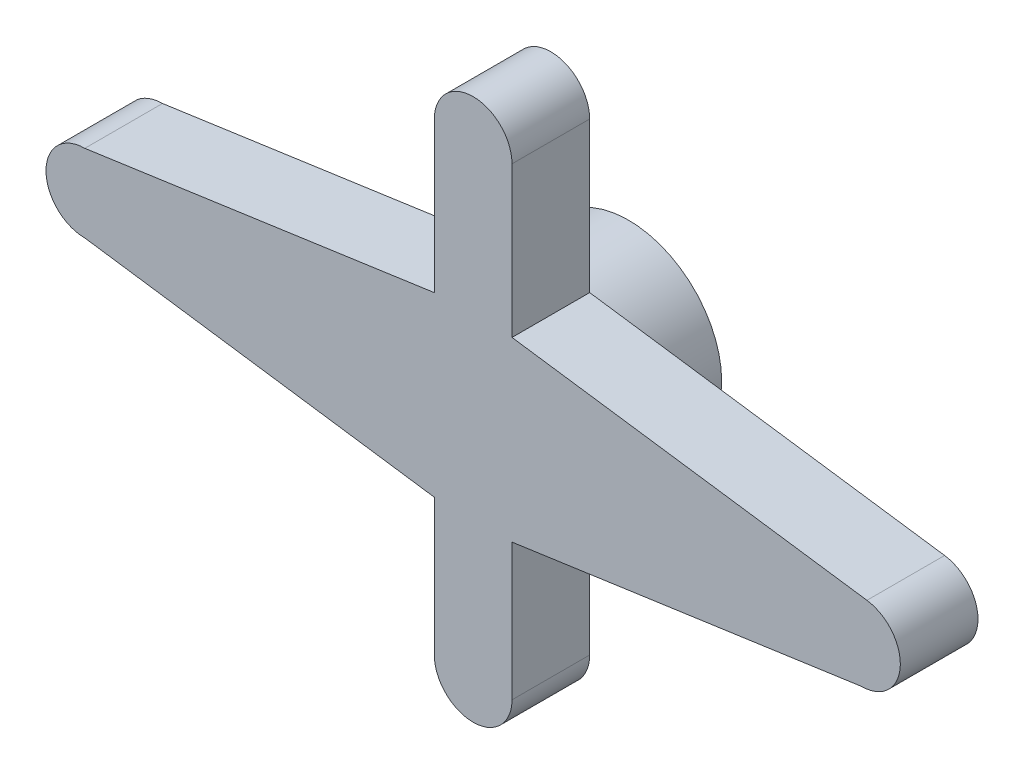
ISO-10303-21;
HEADER;
FILE_DESCRIPTION(('STEP AP214'),'2;1');
FILE_NAME('part.step','',(''),(''),'','','');
FILE_SCHEMA(('AUTOMOTIVE_DESIGN { 1 0 10303 214 1 1 1 1 }'));
ENDSEC;
DATA;
#1=APPLICATION_CONTEXT('core data for automotive mechanical design processes');
#2=APPLICATION_PROTOCOL_DEFINITION('international standard','automotive_design',2000,#1);
#3=PRODUCT_CONTEXT('',#1,'mechanical');
#4=PRODUCT('Part','Part','',(#3));
#5=PRODUCT_RELATED_PRODUCT_CATEGORY('part','',(#4));
#6=PRODUCT_DEFINITION_FORMATION('','',#4);
#7=PRODUCT_DEFINITION_CONTEXT('part definition',#1,'design');
#8=PRODUCT_DEFINITION('design','',#6,#7);
#9=PRODUCT_DEFINITION_SHAPE('','',#8);
#10=(LENGTH_UNIT() NAMED_UNIT(*) SI_UNIT(.MILLI.,.METRE.));
#11=(NAMED_UNIT(*) PLANE_ANGLE_UNIT() SI_UNIT($,.RADIAN.));
#12=(NAMED_UNIT(*) SI_UNIT($,.STERADIAN.) SOLID_ANGLE_UNIT());
#13=UNCERTAINTY_MEASURE_WITH_UNIT(LENGTH_MEASURE(1.E-05),#10,'distance_accuracy_value','');
#14=(GEOMETRIC_REPRESENTATION_CONTEXT(3) GLOBAL_UNCERTAINTY_ASSIGNED_CONTEXT((#13)) GLOBAL_UNIT_ASSIGNED_CONTEXT((#10,
#11,#12)) REPRESENTATION_CONTEXT('',''));
#15=CARTESIAN_POINT('',(0.,0.,0.));
#16=DIRECTION('',(0.,0.,1.));
#17=DIRECTION('',(1.,0.,0.));
#18=AXIS2_PLACEMENT_3D('',#15,#16,#17);
#19=CARTESIAN_POINT('',(0.,0.,0.));
#20=DIRECTION('',(0.,0.,1.));
#21=DIRECTION('',(1.,0.,0.));
#22=AXIS2_PLACEMENT_3D('',#19,#20,#21);
#23=PLANE('',#22);
#24=CARTESIAN_POINT('',(0.,0.,0.));
#25=DIRECTION('',(0.,0.,1.));
#26=DIRECTION('',(1.,0.,0.));
#27=AXIS2_PLACEMENT_3D('',#24,#25,#26);
#28=CIRCLE('',#27,5.);
#29=CARTESIAN_POINT('',(5.,0.,0.));
#30=VERTEX_POINT('',#29);
#31=EDGE_CURVE('E221',#30,#30,#28,.T.);
#32=ORIENTED_EDGE('',*,*,#31,.T.);
#33=EDGE_LOOP('',(#32));
#34=FACE_BOUND('',#33,.T.);
#35=CARTESIAN_POINT('',(0.,0.,0.));
#36=DIRECTION('',(0.,0.,1.));
#37=DIRECTION('',(1.,0.,0.));
#38=AXIS2_PLACEMENT_3D('',#35,#36,#37);
#39=CIRCLE('',#38,6.);
#40=CARTESIAN_POINT('',(6.,0.,0.));
#41=VERTEX_POINT('',#40);
#42=EDGE_CURVE('E49',#41,#41,#39,.T.);
#43=ORIENTED_EDGE('',*,*,#42,.F.);
#44=EDGE_LOOP('',(#43));
#45=FACE_BOUND('',#44,.T.);
#46=ADVANCED_FACE('F45',(#34,#45),#23,.F.);
#47=CARTESIAN_POINT('',(0.,0.,0.));
#48=DIRECTION('',(0.,0.,1.));
#49=DIRECTION('',(1.,0.,0.));
#50=AXIS2_PLACEMENT_3D('',#47,#48,#49);
#51=CYLINDRICAL_SURFACE('',#50,6.);
#52=CARTESIAN_POINT('',(0.,0.,5.));
#53=DIRECTION('',(0.,0.,1.));
#54=DIRECTION('',(1.,0.,0.));
#55=AXIS2_PLACEMENT_3D('',#52,#53,#54);
#56=CIRCLE('',#55,6.);
#57=CARTESIAN_POINT('',(6.,0.,5.));
#58=VERTEX_POINT('',#57);
#59=EDGE_CURVE('E12',#58,#58,#56,.T.);
#60=ORIENTED_EDGE('',*,*,#59,.F.);
#61=EDGE_LOOP('',(#60));
#62=FACE_BOUND('',#61,.T.);
#63=ORIENTED_EDGE('',*,*,#42,.T.);
#64=EDGE_LOOP('',(#63));
#65=FACE_BOUND('',#64,.T.);
#66=ADVANCED_FACE('F47',(#62,#65),#51,.T.);
#67=CARTESIAN_POINT('',(0.,0.,0.));
#68=DIRECTION('',(0.,0.,1.));
#69=DIRECTION('',(1.,0.,0.));
#70=AXIS2_PLACEMENT_3D('',#67,#68,#69);
#71=CYLINDRICAL_SURFACE('',#70,5.);
#72=CARTESIAN_POINT('',(0.,0.,5.));
#73=DIRECTION('',(0.,0.,1.));
#74=DIRECTION('',(1.,0.,0.));
#75=AXIS2_PLACEMENT_3D('',#72,#73,#74);
#76=CIRCLE('',#75,5.);
#77=CARTESIAN_POINT('',(5.,0.,5.));
#78=VERTEX_POINT('',#77);
#79=EDGE_CURVE('E220',#78,#78,#76,.T.);
#80=ORIENTED_EDGE('',*,*,#79,.T.);
#81=EDGE_LOOP('',(#80));
#82=FACE_BOUND('',#81,.T.);
#83=ORIENTED_EDGE('',*,*,#31,.F.);
#84=EDGE_LOOP('',(#83));
#85=FACE_BOUND('',#84,.T.);
#86=ADVANCED_FACE('F227',(#82,#85),#71,.F.);
#87=CARTESIAN_POINT('',(-25.,0.,5.));
#88=DIRECTION('',(0.,0.,1.));
#89=DIRECTION('',(1.,0.,0.));
#90=AXIS2_PLACEMENT_3D('',#87,#88,#89);
#91=PLANE('',#90);
#92=ORIENTED_EDGE('',*,*,#59,.T.);
#93=EDGE_LOOP('',(#92));
#94=FACE_BOUND('',#93,.T.);
#95=CARTESIAN_POINT('',(-25.,0.,5.));
#96=DIRECTION('',(0.,0.,1.));
#97=DIRECTION('',(1.,0.,0.));
#98=AXIS2_PLACEMENT_3D('',#95,#96,#97);
#99=CIRCLE('',#98,2.5);
#100=CARTESIAN_POINT('',(-25.,2.5,5.));
#101=VERTEX_POINT('',#100);
#102=CARTESIAN_POINT('',(-25.,-2.5,5.));
#103=VERTEX_POINT('',#102);
#104=EDGE_CURVE('E168',#101,#103,#99,.T.);
#105=ORIENTED_EDGE('',*,*,#104,.F.);
#106=DIRECTION('',(0.990013224396831,0.140974520816319,0.));
#107=VECTOR('',#106,1.);
#108=CARTESIAN_POINT('',(-25.,2.5,5.));
#109=LINE('',#108,#107);
#110=CARTESIAN_POINT('',(-2.5,5.70392358425282,5.));
#111=VERTEX_POINT('',#110);
#112=EDGE_CURVE('E195',#101,#111,#109,.T.);
#113=ORIENTED_EDGE('',*,*,#112,.T.);
#114=DIRECTION('',(0.,-1.,0.));
#115=VECTOR('',#114,1.);
#116=CARTESIAN_POINT('',(-2.5,15.384581874595,5.));
#117=LINE('',#116,#115);
#118=CARTESIAN_POINT('',(-2.5,15.384581874595,5.));
#119=VERTEX_POINT('',#118);
#120=EDGE_CURVE('E193',#119,#111,#117,.T.);
#121=ORIENTED_EDGE('',*,*,#120,.F.);
#122=CARTESIAN_POINT('',(0.,15.384581874595,5.));
#123=DIRECTION('',(0.,0.,1.));
#124=DIRECTION('',(1.,0.,0.));
#125=AXIS2_PLACEMENT_3D('',#122,#123,#124);
#126=CIRCLE('',#125,2.5);
#127=CARTESIAN_POINT('',(2.5,15.384581874595,5.));
#128=VERTEX_POINT('',#127);
#129=EDGE_CURVE('E157',#128,#119,#126,.T.);
#130=ORIENTED_EDGE('',*,*,#129,.F.);
#131=DIRECTION('',(0.,-1.,0.));
#132=VECTOR('',#131,1.);
#133=CARTESIAN_POINT('',(2.5,15.384581874595,5.));
#134=LINE('',#133,#132);
#135=CARTESIAN_POINT('',(2.5,5.70562885237556,5.));
#136=VERTEX_POINT('',#135);
#137=EDGE_CURVE('E189',#128,#136,#134,.T.);
#138=ORIENTED_EDGE('',*,*,#137,.T.);
#139=DIRECTION('',(0.990154918840871,-0.139975843256002,0.));
#140=VECTOR('',#139,1.);
#141=CARTESIAN_POINT('',(2.5,5.70562885237556,5.));
#142=LINE('',#141,#140);
#143=CARTESIAN_POINT('',(25.34993960814,2.47538729710218,5.));
#144=VERTEX_POINT('',#143);
#145=EDGE_CURVE('E186',#136,#144,#142,.T.);
#146=ORIENTED_EDGE('',*,*,#145,.T.);
#147=CARTESIAN_POINT('',(25.,0.,5.));
#148=DIRECTION('',(0.,0.,1.));
#149=DIRECTION('',(1.,0.,0.));
#150=AXIS2_PLACEMENT_3D('',#147,#148,#149);
#151=CIRCLE('',#150,2.5);
#152=CARTESIAN_POINT('',(25.,-2.5,5.));
#153=VERTEX_POINT('',#152);
#154=EDGE_CURVE('E183',#153,#144,#151,.T.);
#155=ORIENTED_EDGE('',*,*,#154,.F.);
#156=DIRECTION('',(-0.990013224396831,-0.140974520816319,0.));
#157=VECTOR('',#156,1.);
#158=CARTESIAN_POINT('',(25.,-2.5,5.));
#159=LINE('',#158,#157);
#160=CARTESIAN_POINT('',(2.5,-5.70392358425282,5.));
#161=VERTEX_POINT('',#160);
#162=EDGE_CURVE('E180',#153,#161,#159,.T.);
#163=ORIENTED_EDGE('',*,*,#162,.T.);
#164=DIRECTION('',(0.,-1.,0.));
#165=VECTOR('',#164,1.);
#166=CARTESIAN_POINT('',(2.5,-5.70392358425282,5.));
#167=LINE('',#166,#165);
#168=CARTESIAN_POINT('',(2.5,-14.4986310657942,5.));
#169=VERTEX_POINT('',#168);
#170=EDGE_CURVE('E177',#161,#169,#167,.T.);
#171=ORIENTED_EDGE('',*,*,#170,.T.);
#172=CARTESIAN_POINT('',(0.,-14.4986310657942,5.));
#173=DIRECTION('',(0.,0.,1.));
#174=DIRECTION('',(1.,0.,0.));
#175=AXIS2_PLACEMENT_3D('',#172,#173,#174);
#176=CIRCLE('',#175,2.5);
#177=CARTESIAN_POINT('',(-2.5,-14.4986310657942,5.));
#178=VERTEX_POINT('',#177);
#179=EDGE_CURVE('E174',#178,#169,#176,.T.);
#180=ORIENTED_EDGE('',*,*,#179,.F.);
#181=DIRECTION('',(0.,-1.,0.));
#182=VECTOR('',#181,1.);
#183=CARTESIAN_POINT('',(-2.5,-5.70392358425282,5.));
#184=LINE('',#183,#182);
#185=CARTESIAN_POINT('',(-2.5,-5.70392358425282,5.));
#186=VERTEX_POINT('',#185);
#187=EDGE_CURVE('E172',#186,#178,#184,.T.);
#188=ORIENTED_EDGE('',*,*,#187,.F.);
#189=DIRECTION('',(0.990013224396831,-0.140974520816319,0.));
#190=VECTOR('',#189,1.);
#191=CARTESIAN_POINT('',(-25.,-2.5,5.));
#192=LINE('',#191,#190);
#193=EDGE_CURVE('E170',#103,#186,#192,.T.);
#194=ORIENTED_EDGE('',*,*,#193,.F.);
#195=EDGE_LOOP('',(#105,#113,#121,#130,#138,#146,#155,#163,#171,#180,#188,#194));
#196=FACE_BOUND('',#195,.T.);
#197=ADVANCED_FACE('F234',(#94,#196),#91,.F.);
#198=CARTESIAN_POINT('',(-25.,0.,10.));
#199=DIRECTION('',(0.,0.,1.));
#200=DIRECTION('',(1.,0.,0.));
#201=AXIS2_PLACEMENT_3D('',#198,#199,#200);
#202=PLANE('',#201);
#203=CARTESIAN_POINT('',(-25.,0.,10.));
#204=DIRECTION('',(0.,0.,1.));
#205=DIRECTION('',(1.,0.,0.));
#206=AXIS2_PLACEMENT_3D('',#203,#204,#205);
#207=CIRCLE('',#206,2.5);
#208=CARTESIAN_POINT('',(-25.,2.5,10.));
#209=VERTEX_POINT('',#208);
#210=CARTESIAN_POINT('',(-25.,-2.5,10.));
#211=VERTEX_POINT('',#210);
#212=EDGE_CURVE('E198',#209,#211,#207,.T.);
#213=ORIENTED_EDGE('',*,*,#212,.T.);
#214=DIRECTION('',(0.990013224396831,-0.140974520816319,0.));
#215=VECTOR('',#214,1.);
#216=CARTESIAN_POINT('',(-25.,-2.5,10.));
#217=LINE('',#216,#215);
#218=CARTESIAN_POINT('',(-2.5,-5.70392358425282,10.));
#219=VERTEX_POINT('',#218);
#220=EDGE_CURVE('E114',#211,#219,#217,.T.);
#221=ORIENTED_EDGE('',*,*,#220,.T.);
#222=DIRECTION('',(0.,-1.,0.));
#223=VECTOR('',#222,1.);
#224=CARTESIAN_POINT('',(-2.5,-5.70392358425282,10.));
#225=LINE('',#224,#223);
#226=CARTESIAN_POINT('',(-2.5,-14.4986310657942,10.));
#227=VERTEX_POINT('',#226);
#228=EDGE_CURVE('E303',#219,#227,#225,.T.);
#229=ORIENTED_EDGE('',*,*,#228,.T.);
#230=CARTESIAN_POINT('',(0.,-14.4986310657942,10.));
#231=DIRECTION('',(0.,0.,1.));
#232=DIRECTION('',(1.,0.,0.));
#233=AXIS2_PLACEMENT_3D('',#230,#231,#232);
#234=CIRCLE('',#233,2.5);
#235=CARTESIAN_POINT('',(2.5,-14.4986310657942,10.));
#236=VERTEX_POINT('',#235);
#237=EDGE_CURVE('E309',#227,#236,#234,.T.);
#238=ORIENTED_EDGE('',*,*,#237,.T.);
#239=DIRECTION('',(0.,-1.,0.));
#240=VECTOR('',#239,1.);
#241=CARTESIAN_POINT('',(2.5,-5.70392358425282,10.));
#242=LINE('',#241,#240);
#243=CARTESIAN_POINT('',(2.5,-5.70392358425282,10.));
#244=VERTEX_POINT('',#243);
#245=EDGE_CURVE('E311',#244,#236,#242,.T.);
#246=ORIENTED_EDGE('',*,*,#245,.F.);
#247=DIRECTION('',(-0.990013224396831,-0.140974520816319,0.));
#248=VECTOR('',#247,1.);
#249=CARTESIAN_POINT('',(25.,-2.5,10.));
#250=LINE('',#249,#248);
#251=CARTESIAN_POINT('',(25.,-2.5,10.));
#252=VERTEX_POINT('',#251);
#253=EDGE_CURVE('E313',#252,#244,#250,.T.);
#254=ORIENTED_EDGE('',*,*,#253,.F.);
#255=CARTESIAN_POINT('',(25.,0.,10.));
#256=DIRECTION('',(0.,0.,1.));
#257=DIRECTION('',(1.,0.,0.));
#258=AXIS2_PLACEMENT_3D('',#255,#256,#257);
#259=CIRCLE('',#258,2.5);
#260=CARTESIAN_POINT('',(25.34993960814,2.47538729710218,10.));
#261=VERTEX_POINT('',#260);
#262=EDGE_CURVE('E320',#252,#261,#259,.T.);
#263=ORIENTED_EDGE('',*,*,#262,.T.);
#264=DIRECTION('',(0.990154918840871,-0.139975843256002,0.));
#265=VECTOR('',#264,1.);
#266=CARTESIAN_POINT('',(2.5,5.70562885237556,10.));
#267=LINE('',#266,#265);
#268=CARTESIAN_POINT('',(2.5,5.70562885237556,10.));
#269=VERTEX_POINT('',#268);
#270=EDGE_CURVE('E322',#269,#261,#267,.T.);
#271=ORIENTED_EDGE('',*,*,#270,.F.);
#272=DIRECTION('',(0.,-1.,0.));
#273=VECTOR('',#272,1.);
#274=CARTESIAN_POINT('',(2.5,15.384581874595,10.));
#275=LINE('',#274,#273);
#276=CARTESIAN_POINT('',(2.5,15.384581874595,10.));
#277=VERTEX_POINT('',#276);
#278=EDGE_CURVE('E150',#277,#269,#275,.T.);
#279=ORIENTED_EDGE('',*,*,#278,.F.);
#280=CARTESIAN_POINT('',(0.,15.384581874595,10.));
#281=DIRECTION('',(0.,0.,1.));
#282=DIRECTION('',(1.,0.,0.));
#283=AXIS2_PLACEMENT_3D('',#280,#281,#282);
#284=CIRCLE('',#283,2.5);
#285=CARTESIAN_POINT('',(-2.5,15.384581874595,10.));
#286=VERTEX_POINT('',#285);
#287=EDGE_CURVE('E142',#277,#286,#284,.T.);
#288=ORIENTED_EDGE('',*,*,#287,.T.);
#289=DIRECTION('',(0.,-1.,0.));
#290=VECTOR('',#289,1.);
#291=CARTESIAN_POINT('',(-2.5,15.384581874595,10.));
#292=LINE('',#291,#290);
#293=CARTESIAN_POINT('',(-2.5,5.70392358425282,10.));
#294=VERTEX_POINT('',#293);
#295=EDGE_CURVE('E147',#286,#294,#292,.T.);
#296=ORIENTED_EDGE('',*,*,#295,.T.);
#297=DIRECTION('',(0.990013224396831,0.140974520816319,0.));
#298=VECTOR('',#297,1.);
#299=CARTESIAN_POINT('',(-25.,2.5,10.));
#300=LINE('',#299,#298);
#301=EDGE_CURVE('E163',#209,#294,#300,.T.);
#302=ORIENTED_EDGE('',*,*,#301,.F.);
#303=EDGE_LOOP('',(#213,#221,#229,#238,#246,#254,#263,#271,#279,#288,#296,#302));
#304=FACE_BOUND('',#303,.T.);
#305=ADVANCED_FACE('F144',(#304),#202,.T.);
#306=CARTESIAN_POINT('',(-25.,2.5,10.));
#307=DIRECTION('',(-0.140974520816319,0.990013224396831,0.));
#308=DIRECTION('',(-0.99001322439683,-0.140974520816319,0.));
#309=AXIS2_PLACEMENT_3D('',#306,#307,#308);
#310=PLANE('',#309);
#311=ORIENTED_EDGE('',*,*,#112,.F.);
#312=DIRECTION('',(0.,0.,-1.));
#313=VECTOR('',#312,1.);
#314=CARTESIAN_POINT('',(-25.,2.5,10.));
#315=LINE('',#314,#313);
#316=EDGE_CURVE('E62',#209,#101,#315,.T.);
#317=ORIENTED_EDGE('',*,*,#316,.F.);
#318=ORIENTED_EDGE('',*,*,#301,.T.);
#319=DIRECTION('',(0.,0.,-1.));
#320=VECTOR('',#319,1.);
#321=CARTESIAN_POINT('',(-2.5,5.70392358425282,10.));
#322=LINE('',#321,#320);
#323=EDGE_CURVE('E101',#294,#111,#322,.T.);
#324=ORIENTED_EDGE('',*,*,#323,.T.);
#325=EDGE_LOOP('',(#311,#317,#318,#324));
#326=FACE_BOUND('',#325,.T.);
#327=ADVANCED_FACE('F260',(#326),#310,.T.);
#328=CARTESIAN_POINT('',(-2.5,15.384581874595,10.));
#329=DIRECTION('',(1.,0.,0.));
#330=DIRECTION('',(0.,1.,0.));
#331=AXIS2_PLACEMENT_3D('',#328,#329,#330);
#332=PLANE('',#331);
#333=ORIENTED_EDGE('',*,*,#120,.T.);
#334=ORIENTED_EDGE('',*,*,#323,.F.);
#335=ORIENTED_EDGE('',*,*,#295,.F.);
#336=DIRECTION('',(0.,0.,-1.));
#337=VECTOR('',#336,1.);
#338=CARTESIAN_POINT('',(-2.5,15.384581874595,10.));
#339=LINE('',#338,#337);
#340=EDGE_CURVE('E154',#286,#119,#339,.T.);
#341=ORIENTED_EDGE('',*,*,#340,.T.);
#342=EDGE_LOOP('',(#333,#334,#335,#341));
#343=FACE_BOUND('',#342,.T.);
#344=ADVANCED_FACE('F162',(#343),#332,.F.);
#345=CARTESIAN_POINT('',(0.,15.384581874595,10.));
#346=DIRECTION('',(0.,0.,-1.));
#347=DIRECTION('',(-1.,0.,0.));
#348=AXIS2_PLACEMENT_3D('',#345,#346,#347);
#349=CYLINDRICAL_SURFACE('',#348,2.5);
#350=ORIENTED_EDGE('',*,*,#129,.T.);
#351=ORIENTED_EDGE('',*,*,#340,.F.);
#352=ORIENTED_EDGE('',*,*,#287,.F.);
#353=DIRECTION('',(0.,0.,-1.));
#354=VECTOR('',#353,1.);
#355=CARTESIAN_POINT('',(2.5,15.384581874595,10.));
#356=LINE('',#355,#354);
#357=EDGE_CURVE('E160',#277,#128,#356,.T.);
#358=ORIENTED_EDGE('',*,*,#357,.T.);
#359=EDGE_LOOP('',(#350,#351,#352,#358));
#360=FACE_BOUND('',#359,.T.);
#361=ADVANCED_FACE('F155',(#360),#349,.T.);
#362=CARTESIAN_POINT('',(2.5,15.384581874595,10.));
#363=DIRECTION('',(1.,0.,0.));
#364=DIRECTION('',(0.,0.,-1.));
#365=AXIS2_PLACEMENT_3D('',#362,#363,#364);
#366=PLANE('',#365);
#367=ORIENTED_EDGE('',*,*,#137,.F.);
#368=ORIENTED_EDGE('',*,*,#357,.F.);
#369=ORIENTED_EDGE('',*,*,#278,.T.);
#370=DIRECTION('',(0.,0.,-1.));
#371=VECTOR('',#370,1.);
#372=CARTESIAN_POINT('',(2.5,5.70562885237556,10.));
#373=LINE('',#372,#371);
#374=EDGE_CURVE('E202',#269,#136,#373,.T.);
#375=ORIENTED_EDGE('',*,*,#374,.T.);
#376=EDGE_LOOP('',(#367,#368,#369,#375));
#377=FACE_BOUND('',#376,.T.);
#378=ADVANCED_FACE('F270',(#377),#366,.T.);
#379=CARTESIAN_POINT('',(2.5,5.70562885237556,10.));
#380=DIRECTION('',(0.139975843256002,0.990154918840871,0.));
#381=DIRECTION('',(-0.990154918840871,0.139975843256002,0.));
#382=AXIS2_PLACEMENT_3D('',#379,#380,#381);
#383=PLANE('',#382);
#384=ORIENTED_EDGE('',*,*,#145,.F.);
#385=ORIENTED_EDGE('',*,*,#374,.F.);
#386=ORIENTED_EDGE('',*,*,#270,.T.);
#387=DIRECTION('',(0.,0.,-1.));
#388=VECTOR('',#387,1.);
#389=CARTESIAN_POINT('',(25.34993960814,2.47538729710218,10.));
#390=LINE('',#389,#388);
#391=EDGE_CURVE('E204',#261,#144,#390,.T.);
#392=ORIENTED_EDGE('',*,*,#391,.T.);
#393=EDGE_LOOP('',(#384,#385,#386,#392));
#394=FACE_BOUND('',#393,.T.);
#395=ADVANCED_FACE('F273',(#394),#383,.T.);
#396=CARTESIAN_POINT('',(25.,0.,10.));
#397=DIRECTION('',(0.,0.,-1.));
#398=DIRECTION('',(-1.,0.,0.));
#399=AXIS2_PLACEMENT_3D('',#396,#397,#398);
#400=CYLINDRICAL_SURFACE('',#399,2.5);
#401=ORIENTED_EDGE('',*,*,#154,.T.);
#402=ORIENTED_EDGE('',*,*,#391,.F.);
#403=ORIENTED_EDGE('',*,*,#262,.F.);
#404=DIRECTION('',(0.,0.,-1.));
#405=VECTOR('',#404,1.);
#406=CARTESIAN_POINT('',(25.,-2.5,10.));
#407=LINE('',#406,#405);
#408=EDGE_CURVE('E206',#252,#153,#407,.T.);
#409=ORIENTED_EDGE('',*,*,#408,.T.);
#410=EDGE_LOOP('',(#401,#402,#403,#409));
#411=FACE_BOUND('',#410,.T.);
#412=ADVANCED_FACE('F277',(#411),#400,.T.);
#413=CARTESIAN_POINT('',(25.,-2.5,10.));
#414=DIRECTION('',(0.140974520816319,-0.990013224396831,0.));
#415=DIRECTION('',(0.99001322439683,0.140974520816319,0.));
#416=AXIS2_PLACEMENT_3D('',#413,#414,#415);
#417=PLANE('',#416);
#418=ORIENTED_EDGE('',*,*,#162,.F.);
#419=ORIENTED_EDGE('',*,*,#408,.F.);
#420=ORIENTED_EDGE('',*,*,#253,.T.);
#421=DIRECTION('',(0.,0.,-1.));
#422=VECTOR('',#421,1.);
#423=CARTESIAN_POINT('',(2.5,-5.70392358425282,10.));
#424=LINE('',#423,#422);
#425=EDGE_CURVE('E208',#244,#161,#424,.T.);
#426=ORIENTED_EDGE('',*,*,#425,.T.);
#427=EDGE_LOOP('',(#418,#419,#420,#426));
#428=FACE_BOUND('',#427,.T.);
#429=ADVANCED_FACE('F281',(#428),#417,.T.);
#430=CARTESIAN_POINT('',(2.5,-5.70392358425282,10.));
#431=DIRECTION('',(1.,0.,0.));
#432=DIRECTION('',(0.,1.,0.));
#433=AXIS2_PLACEMENT_3D('',#430,#431,#432);
#434=PLANE('',#433);
#435=ORIENTED_EDGE('',*,*,#170,.F.);
#436=ORIENTED_EDGE('',*,*,#425,.F.);
#437=ORIENTED_EDGE('',*,*,#245,.T.);
#438=DIRECTION('',(0.,0.,-1.));
#439=VECTOR('',#438,1.);
#440=CARTESIAN_POINT('',(2.5,-14.4986310657942,10.));
#441=LINE('',#440,#439);
#442=EDGE_CURVE('E210',#236,#169,#441,.T.);
#443=ORIENTED_EDGE('',*,*,#442,.T.);
#444=EDGE_LOOP('',(#435,#436,#437,#443));
#445=FACE_BOUND('',#444,.T.);
#446=ADVANCED_FACE('F285',(#445),#434,.T.);
#447=CARTESIAN_POINT('',(0.,-14.4986310657942,10.));
#448=DIRECTION('',(0.,0.,-1.));
#449=DIRECTION('',(-1.,0.,0.));
#450=AXIS2_PLACEMENT_3D('',#447,#448,#449);
#451=CYLINDRICAL_SURFACE('',#450,2.5);
#452=ORIENTED_EDGE('',*,*,#179,.T.);
#453=ORIENTED_EDGE('',*,*,#442,.F.);
#454=ORIENTED_EDGE('',*,*,#237,.F.);
#455=DIRECTION('',(0.,0.,-1.));
#456=VECTOR('',#455,1.);
#457=CARTESIAN_POINT('',(-2.5,-14.4986310657942,10.));
#458=LINE('',#457,#456);
#459=EDGE_CURVE('E212',#227,#178,#458,.T.);
#460=ORIENTED_EDGE('',*,*,#459,.T.);
#461=EDGE_LOOP('',(#452,#453,#454,#460));
#462=FACE_BOUND('',#461,.T.);
#463=ADVANCED_FACE('F289',(#462),#451,.T.);
#464=CARTESIAN_POINT('',(-2.5,-5.70392358425282,10.));
#465=DIRECTION('',(1.,0.,0.));
#466=DIRECTION('',(0.,1.,0.));
#467=AXIS2_PLACEMENT_3D('',#464,#465,#466);
#468=PLANE('',#467);
#469=ORIENTED_EDGE('',*,*,#187,.T.);
#470=ORIENTED_EDGE('',*,*,#459,.F.);
#471=ORIENTED_EDGE('',*,*,#228,.F.);
#472=DIRECTION('',(0.,0.,-1.));
#473=VECTOR('',#472,1.);
#474=CARTESIAN_POINT('',(-2.5,-5.70392358425282,10.));
#475=LINE('',#474,#473);
#476=EDGE_CURVE('E215',#219,#186,#475,.T.);
#477=ORIENTED_EDGE('',*,*,#476,.T.);
#478=EDGE_LOOP('',(#469,#470,#471,#477));
#479=FACE_BOUND('',#478,.T.);
#480=ADVANCED_FACE('F293',(#479),#468,.F.);
#481=CARTESIAN_POINT('',(-25.,-2.5,10.));
#482=DIRECTION('',(0.140974520816319,0.990013224396831,0.));
#483=DIRECTION('',(-0.990013224396831,0.140974520816319,0.));
#484=AXIS2_PLACEMENT_3D('',#481,#482,#483);
#485=PLANE('',#484);
#486=ORIENTED_EDGE('',*,*,#193,.T.);
#487=ORIENTED_EDGE('',*,*,#476,.F.);
#488=ORIENTED_EDGE('',*,*,#220,.F.);
#489=DIRECTION('',(0.,0.,-1.));
#490=VECTOR('',#489,1.);
#491=CARTESIAN_POINT('',(-25.,-2.5,10.));
#492=LINE('',#491,#490);
#493=EDGE_CURVE('E218',#211,#103,#492,.T.);
#494=ORIENTED_EDGE('',*,*,#493,.T.);
#495=EDGE_LOOP('',(#486,#487,#488,#494));
#496=FACE_BOUND('',#495,.T.);
#497=ADVANCED_FACE('F238',(#496),#485,.F.);
#498=CARTESIAN_POINT('',(-25.,0.,10.));
#499=DIRECTION('',(0.,0.,-1.));
#500=DIRECTION('',(-1.,0.,0.));
#501=AXIS2_PLACEMENT_3D('',#498,#499,#500);
#502=CYLINDRICAL_SURFACE('',#501,2.5);
#503=ORIENTED_EDGE('',*,*,#104,.T.);
#504=ORIENTED_EDGE('',*,*,#493,.F.);
#505=ORIENTED_EDGE('',*,*,#212,.F.);
#506=ORIENTED_EDGE('',*,*,#316,.T.);
#507=EDGE_LOOP('',(#503,#504,#505,#506));
#508=FACE_BOUND('',#507,.T.);
#509=ADVANCED_FACE('F232',(#508),#502,.T.);
#510=ORIENTED_EDGE('',*,*,#79,.F.);
#511=EDGE_LOOP('',(#510));
#512=FACE_BOUND('',#511,.T.);
#513=ADVANCED_FACE('F230',(#512),#91,.F.);
#514=CLOSED_SHELL('',(#46,#66,#86,#197,#305,#327,#344,#361,#378,#395,#412,#429,#446,#463,#480,
#497,#509,#513));
#515=MANIFOLD_SOLID_BREP('B2',#514);
#516=ADVANCED_BREP_SHAPE_REPRESENTATION('',(#18,#515),#14);
#517=SHAPE_DEFINITION_REPRESENTATION(#9,#516);
ENDSEC;
END-ISO-10303-21;
